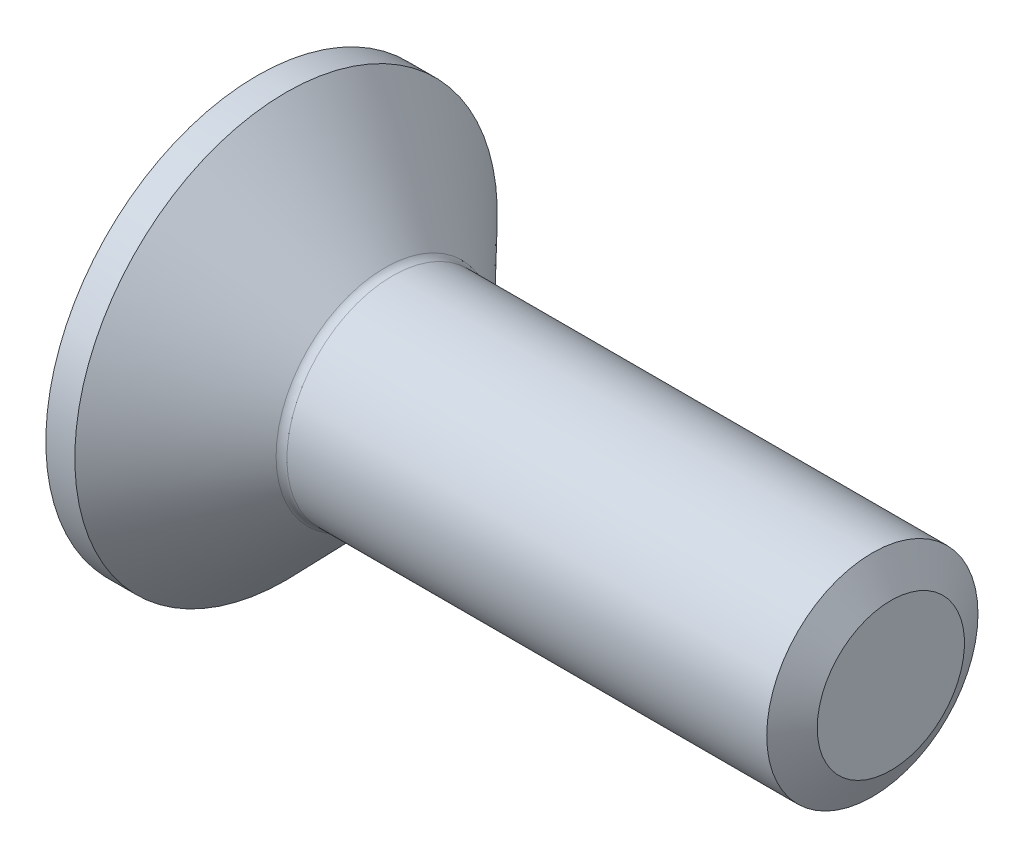
ISO-10303-21;
HEADER;
FILE_DESCRIPTION(('STEP AP214'),'2;1');
FILE_NAME('part.step','',(''),(''),'','','');
FILE_SCHEMA(('AUTOMOTIVE_DESIGN { 1 0 10303 214 1 1 1 1 }'));
ENDSEC;
DATA;
#1=APPLICATION_CONTEXT('core data for automotive mechanical design processes');
#2=APPLICATION_PROTOCOL_DEFINITION('international standard','automotive_design',2000,#1);
#3=PRODUCT_CONTEXT('',#1,'mechanical');
#4=PRODUCT('Part','Part','',(#3));
#5=PRODUCT_RELATED_PRODUCT_CATEGORY('part','',(#4));
#6=PRODUCT_DEFINITION_FORMATION('','',#4);
#7=PRODUCT_DEFINITION_CONTEXT('part definition',#1,'design');
#8=PRODUCT_DEFINITION('design','',#6,#7);
#9=PRODUCT_DEFINITION_SHAPE('','',#8);
#10=(LENGTH_UNIT() NAMED_UNIT(*) SI_UNIT(.MILLI.,.METRE.));
#11=(NAMED_UNIT(*) PLANE_ANGLE_UNIT() SI_UNIT($,.RADIAN.));
#12=(NAMED_UNIT(*) SI_UNIT($,.STERADIAN.) SOLID_ANGLE_UNIT());
#13=UNCERTAINTY_MEASURE_WITH_UNIT(LENGTH_MEASURE(1.E-05),#10,'distance_accuracy_value','');
#14=(GEOMETRIC_REPRESENTATION_CONTEXT(3) GLOBAL_UNCERTAINTY_ASSIGNED_CONTEXT((#13)) GLOBAL_UNIT_ASSIGNED_CONTEXT((#10,
#11,#12)) REPRESENTATION_CONTEXT('',''));
#15=CARTESIAN_POINT('',(0.,0.,0.));
#16=DIRECTION('',(0.,0.,1.));
#17=DIRECTION('',(1.,0.,0.));
#18=AXIS2_PLACEMENT_3D('',#15,#16,#17);
#19=CARTESIAN_POINT('',(0.,0.,0.));
#20=DIRECTION('',(1.,0.,0.));
#21=DIRECTION('',(0.,1.,0.));
#22=AXIS2_PLACEMENT_3D('',#19,#20,#21);
#23=CYLINDRICAL_SURFACE('',#22,2.);
#24=CARTESIAN_POINT('',(-9.43510503675808,0.,0.));
#25=DIRECTION('',(1.,0.,0.));
#26=DIRECTION('',(0.,1.,0.));
#27=AXIS2_PLACEMENT_3D('',#24,#25,#26);
#28=CIRCLE('',#27,2.);
#29=CARTESIAN_POINT('',(-9.43510503675808,2.,0.));
#30=VERTEX_POINT('',#29);
#31=EDGE_CURVE('E125',#30,#30,#28,.T.);
#32=ORIENTED_EDGE('',*,*,#31,.T.);
#33=EDGE_LOOP('',(#32));
#34=FACE_BOUND('',#33,.T.);
#35=CARTESIAN_POINT('',(-0.35,0.,0.));
#36=DIRECTION('',(-1.,0.,0.));
#37=DIRECTION('',(0.,0.,1.));
#38=AXIS2_PLACEMENT_3D('',#35,#36,#37);
#39=CIRCLE('',#38,2.);
#40=CARTESIAN_POINT('',(-0.35,0.,2.));
#41=VERTEX_POINT('',#40);
#42=EDGE_CURVE('E300',#41,#41,#39,.T.);
#43=ORIENTED_EDGE('',*,*,#42,.T.);
#44=EDGE_LOOP('',(#43));
#45=FACE_BOUND('',#44,.T.);
#46=ADVANCED_FACE('F38',(#34,#45),#23,.T.);
#47=CARTESIAN_POINT('',(-12.,4.,0.));
#48=DIRECTION('',(-1.,0.,0.));
#49=DIRECTION('',(0.,-1.,0.));
#50=AXIS2_PLACEMENT_3D('',#47,#48,#49);
#51=PLANE('',#50);
#52=CARTESIAN_POINT('',(-12.,0.,0.));
#53=DIRECTION('',(1.,0.,0.));
#54=DIRECTION('',(0.,1.,0.));
#55=AXIS2_PLACEMENT_3D('',#52,#53,#54);
#56=CIRCLE('',#55,4.);
#57=CARTESIAN_POINT('',(-12.,4.,0.));
#58=VERTEX_POINT('',#57);
#59=EDGE_CURVE('E208',#58,#58,#56,.T.);
#60=ORIENTED_EDGE('',*,*,#59,.F.);
#61=EDGE_LOOP('',(#60));
#62=FACE_BOUND('',#61,.T.);
#63=CARTESIAN_POINT('',(-12.,0.,0.));
#64=DIRECTION('',(-1.,0.,0.));
#65=DIRECTION('',(0.,-1.,0.));
#66=AXIS2_PLACEMENT_3D('',#63,#64,#65);
#67=CIRCLE('',#66,1.44337567297406);
#68=CARTESIAN_POINT('',(-12.,-0.721687836487038,1.24999999999999));
#69=VERTEX_POINT('',#68);
#70=CARTESIAN_POINT('',(-12.,-1.44337567297406,0.));
#71=VERTEX_POINT('',#70);
#72=EDGE_CURVE('E42',#69,#71,#67,.F.);
#73=ORIENTED_EDGE('',*,*,#72,.T.);
#74=CARTESIAN_POINT('',(-12.,-0.721687836487037,-1.24999999999999));
#75=VERTEX_POINT('',#74);
#76=EDGE_CURVE('E11',#71,#75,#67,.F.);
#77=ORIENTED_EDGE('',*,*,#76,.T.);
#78=CARTESIAN_POINT('',(-12.,0.721687836487031,-1.25));
#79=VERTEX_POINT('',#78);
#80=EDGE_CURVE('E47',#75,#79,#67,.F.);
#81=ORIENTED_EDGE('',*,*,#80,.T.);
#82=CARTESIAN_POINT('',(-12.,1.44337567297406,0.));
#83=VERTEX_POINT('',#82);
#84=EDGE_CURVE('E112',#79,#83,#67,.F.);
#85=ORIENTED_EDGE('',*,*,#84,.T.);
#86=CARTESIAN_POINT('',(-12.,0.,0.));
#87=DIRECTION('',(-1.,0.,0.));
#88=DIRECTION('',(0.,0.,1.));
#89=AXIS2_PLACEMENT_3D('',#86,#87,#88);
#90=CIRCLE('',#89,1.44337567297406);
#91=CARTESIAN_POINT('',(-12.,0.721687836487035,1.25));
#92=VERTEX_POINT('',#91);
#93=EDGE_CURVE('E97',#92,#83,#90,.T.);
#94=ORIENTED_EDGE('',*,*,#93,.F.);
#95=EDGE_CURVE('E106',#92,#69,#67,.F.);
#96=ORIENTED_EDGE('',*,*,#95,.T.);
#97=EDGE_LOOP('',(#73,#77,#81,#85,#94,#96));
#98=FACE_BOUND('',#97,.T.);
#99=ADVANCED_FACE('F113',(#62,#98),#51,.T.);
#100=CARTESIAN_POINT('',(0.,0.,0.));
#101=DIRECTION('',(1.,0.,0.));
#102=DIRECTION('',(0.,1.,0.));
#103=AXIS2_PLACEMENT_3D('',#100,#101,#102);
#104=CYLINDRICAL_SURFACE('',#103,4.);
#105=ORIENTED_EDGE('',*,*,#59,.T.);
#106=EDGE_LOOP('',(#105));
#107=FACE_BOUND('',#106,.T.);
#108=CARTESIAN_POINT('',(-11.4513775496141,0.,0.));
#109=DIRECTION('',(1.,0.,0.));
#110=DIRECTION('',(0.,1.,0.));
#111=AXIS2_PLACEMENT_3D('',#108,#109,#110);
#112=CIRCLE('',#111,4.);
#113=CARTESIAN_POINT('',(-11.4513775496141,4.,0.));
#114=VERTEX_POINT('',#113);
#115=EDGE_CURVE('E210',#114,#114,#112,.T.);
#116=ORIENTED_EDGE('',*,*,#115,.F.);
#117=EDGE_LOOP('',(#116));
#118=FACE_BOUND('',#117,.T.);
#119=ADVANCED_FACE('F198',(#107,#118),#104,.T.);
#120=CARTESIAN_POINT('',(-9.57897299682581,0.,0.));
#121=DIRECTION('',(-1.,0.,0.));
#122=DIRECTION('',(0.,-1.,0.));
#123=AXIS2_PLACEMENT_3D('',#120,#121,#122);
#124=CONICAL_SURFACE('',#123,2.0610683259082,0.802851455917394);
#125=ORIENTED_EDGE('',*,*,#115,.T.);
#126=EDGE_LOOP('',(#125));
#127=FACE_BOUND('',#126,.T.);
#128=CARTESIAN_POINT('',(-9.57897299682581,0.,0.));
#129=DIRECTION('',(1.,0.,0.));
#130=DIRECTION('',(0.,1.,0.));
#131=AXIS2_PLACEMENT_3D('',#128,#129,#130);
#132=CIRCLE('',#131,2.0610683259082);
#133=CARTESIAN_POINT('',(-9.57897299682581,2.0610683259082,0.));
#134=VERTEX_POINT('',#133);
#135=EDGE_CURVE('E214',#134,#134,#132,.T.);
#136=ORIENTED_EDGE('',*,*,#135,.F.);
#137=EDGE_LOOP('',(#136));
#138=FACE_BOUND('',#137,.T.);
#139=ADVANCED_FACE('F194',(#127,#138),#124,.T.);
#140=CARTESIAN_POINT('',(-9.43510503675808,0.,0.));
#141=DIRECTION('',(1.,0.,0.));
#142=DIRECTION('',(0.,1.,0.));
#143=AXIS2_PLACEMENT_3D('',#140,#141,#142);
#144=TOROIDAL_SURFACE('',#143,2.2,0.200000000000001);
#145=ORIENTED_EDGE('',*,*,#135,.T.);
#146=EDGE_LOOP('',(#145));
#147=FACE_BOUND('',#146,.T.);
#148=ORIENTED_EDGE('',*,*,#31,.F.);
#149=EDGE_LOOP('',(#148));
#150=FACE_BOUND('',#149,.T.);
#151=ADVANCED_FACE('F190',(#147,#150),#144,.F.);
#152=CARTESIAN_POINT('',(-11.593,0.,0.));
#153=DIRECTION('',(-1.,0.,0.));
#154=DIRECTION('',(0.,0.,1.));
#155=AXIS2_PLACEMENT_3D('',#152,#153,#154);
#156=CONICAL_SURFACE('',#155,0.,1.29595448752628);
#157=CARTESIAN_POINT('',(-12.0000325639069,-0.721572366433196,1.2502));
#158=CARTESIAN_POINT('',(-11.991576864719,-0.751541131585368,1.19829257611634));
#159=CARTESIAN_POINT('',(-11.9838983725877,-0.781569978777701,1.1462810870865));
#160=CARTESIAN_POINT('',(-11.9704054515754,-0.841745134078227,1.04205466075264));
#161=CARTESIAN_POINT('',(-11.964591866691,-0.871891489137523,0.989839642126926));
#162=CARTESIAN_POINT('',(-11.9551735985119,-0.932099362057423,0.885556547214009));
#163=CARTESIAN_POINT('',(-11.9515564854096,-0.962160380653126,0.833489335678977));
#164=CARTESIAN_POINT('',(-11.9467061131036,-1.02232485811963,0.729281403896156));
#165=CARTESIAN_POINT('',(-11.9454723393403,-1.05242830642509,0.677140701948078));
#166=CARTESIAN_POINT('',(-11.9454723393403,-1.11263520303601,0.572859298051921));
#167=CARTESIAN_POINT('',(-11.9467061131036,-1.14273865134147,0.520718596103843));
#168=CARTESIAN_POINT('',(-11.9515564854096,-1.20290312880797,0.416510664321023));
#169=CARTESIAN_POINT('',(-11.9551735985119,-1.23296414740368,0.364443452785991));
#170=CARTESIAN_POINT('',(-11.964591866691,-1.29317202032358,0.260160357873074));
#171=CARTESIAN_POINT('',(-11.9704054515754,-1.32331837538287,0.207945339247363));
#172=CARTESIAN_POINT('',(-11.9838983725877,-1.3834935306834,0.103718912913504));
#173=CARTESIAN_POINT('',(-11.991576864719,-1.41352237787573,0.0517074238836609));
#174=CARTESIAN_POINT('',(-12.0000325639069,-1.4434911430279,-0.000199999999999676));
#175=B_SPLINE_CURVE_WITH_KNOTS('',3,(#157,#158,#159,#160,#161,#162,#163,#164,#165,#166,#167,
#168,#169,#170,#171,#172,#173,#174),.UNSPECIFIED.,.F.,.F.,(4,2,2,2,2,2,2,2,4),(0.,
0.18160374958483,0.36328957156208,0.543937414070992,0.72454625060746,0.905155087143927,
1.08580292965284,1.26748875163009,1.44909250121492),.UNSPECIFIED.);
#176=EDGE_CURVE('E131',#69,#71,#175,.T.);
#177=ORIENTED_EDGE('',*,*,#176,.T.);
#178=ORIENTED_EDGE('',*,*,#72,.F.);
#179=EDGE_LOOP('',(#177,#178));
#180=FACE_BOUND('',#179,.T.);
#181=ADVANCED_FACE('F193',(#180),#156,.F.);
#182=CARTESIAN_POINT('',(-12.230054854727,-1.88192774876372,1.25));
#183=CARTESIAN_POINT('',(-12.2168061816408,-1.8255137400607,1.25));
#184=CARTESIAN_POINT('',(-12.2037258112081,-1.76906017891574,1.25));
#185=CARTESIAN_POINT('',(-12.1779869751788,-1.65605409957583,1.25));
#186=CARTESIAN_POINT('',(-12.1653285307257,-1.59950157657072,1.25));
#187=CARTESIAN_POINT('',(-12.1280879422272,-1.42954612490577,1.25));
#188=CARTESIAN_POINT('',(-12.1042709227473,-1.31597293305457,1.25));
#189=CARTESIAN_POINT('',(-12.0599692539508,-1.08931538105831,1.25));
#190=CARTESIAN_POINT('',(-12.0394543826368,-0.976237048644353,1.25));
#191=CARTESIAN_POINT('',(-12.0031083621366,-0.74933253215309,1.25));
#192=CARTESIAN_POINT('',(-11.9872761488083,-0.635506524005941,1.25));
#193=CARTESIAN_POINT('',(-11.9623551261036,-0.40561706752441,1.25));
#194=CARTESIAN_POINT('',(-11.9533532269162,-0.289543448802647,1.25));
#195=CARTESIAN_POINT('',(-11.9465899221525,-0.115205222838835,1.25));
#196=CARTESIAN_POINT('',(-11.9454583626773,-0.0570644643245781,1.25));
#197=CARTESIAN_POINT('',(-11.9454865772141,0.0592166170352035,1.25));
#198=CARTESIAN_POINT('',(-11.9466463560642,0.117356939879549,1.25));
#199=CARTESIAN_POINT('',(-11.9535104843876,0.29216922677383,1.25));
#200=CARTESIAN_POINT('',(-11.9626193191916,0.408714396179603,1.25));
#201=CARTESIAN_POINT('',(-11.987953181016,0.641062051570891,1.25));
#202=CARTESIAN_POINT('',(-12.0041839479739,0.7568638619043,1.25));
#203=CARTESIAN_POINT('',(-12.0420513932587,0.991534965339216,1.25));
#204=CARTESIAN_POINT('',(-12.063850897622,1.11037712244683,1.25));
#205=CARTESIAN_POINT('',(-12.1107131319875,1.34742332227276,1.25));
#206=CARTESIAN_POINT('',(-12.1357764440616,1.46562724724241,1.25));
#207=CARTESIAN_POINT('',(-12.1880082919745,1.70160185265613,1.25));
#208=CARTESIAN_POINT('',(-12.2151774684754,1.81937238974697,1.25));
#209=CARTESIAN_POINT('',(-12.2709069397528,2.05458449010658,1.25));
#210=CARTESIAN_POINT('',(-12.2994672676032,2.17202604548372,1.25));
#211=CARTESIAN_POINT('',(-12.3571404984079,2.40505512634129,1.25));
#212=CARTESIAN_POINT('',(-12.3862403573857,2.52064589314675,1.25));
#213=CARTESIAN_POINT('',(-12.4451006119577,2.7516618269686,1.25));
#214=CARTESIAN_POINT('',(-12.4748610242592,2.86708698971762,1.25));
#215=CARTESIAN_POINT('',(-12.534817355156,3.09763737586545,1.25));
#216=CARTESIAN_POINT('',(-12.5650125463553,3.21276278881204,1.25));
#217=CARTESIAN_POINT('',(-12.6257689948511,3.44291215791421,1.25));
#218=CARTESIAN_POINT('',(-12.656330237577,3.55793611791374,1.25));
#219=CARTESIAN_POINT('',(-12.687019012393,3.67292565898518,1.25));
#220=B_SPLINE_CURVE_WITH_KNOTS('',3,(#182,#183,#184,#185,#186,#187,#188,#189,#190,#191,#192,
#193,#194,#195,#196,#197,#198,#199,#200,#201,#202,#203,#204,#205,#206,#207,#208,#209,#210,#211,
#212,#213,#214,#215,#216,#217,#218,#219),.UNSPECIFIED.,.F.,.F.,(4,2,2,2,2,2,2,2,2,2,2,2,2,2,2,2,
2,2,4),(0.,0.173845962501762,0.347700623700958,0.695803457931749,1.04051283645618,
1.38514381887278,1.73408963262349,1.90850297063879,2.08291667692807,2.43329501130733,
2.78395625407464,3.14636001893446,3.50882850410612,3.87140769831936,4.2339955168655,
4.59158519290896,4.94918392371833,5.30624137064038,5.66328465178794),.UNSPECIFIED.);
#221=EDGE_CURVE('E102',#92,#69,#220,.F.);
#222=ORIENTED_EDGE('',*,*,#221,.T.);
#223=ORIENTED_EDGE('',*,*,#95,.F.);
#224=EDGE_LOOP('',(#222,#223));
#225=FACE_BOUND('',#224,.T.);
#226=ADVANCED_FACE('F107',(#225),#156,.F.);
#227=CARTESIAN_POINT('',(-12.0000325639069,1.4434911430279,-0.000200000000000113));
#228=CARTESIAN_POINT('',(-11.991576864719,1.41352237787573,0.0517074238836606));
#229=CARTESIAN_POINT('',(-11.9838983725877,1.3834935306834,0.103718912913504));
#230=CARTESIAN_POINT('',(-11.9704054515754,1.32331837538287,0.207945339247363));
#231=CARTESIAN_POINT('',(-11.964591866691,1.29317202032357,0.260160357873074));
#232=CARTESIAN_POINT('',(-11.9551735985119,1.23296414740367,0.364443452785991));
#233=CARTESIAN_POINT('',(-11.9515564854096,1.20290312880797,0.416510664321023));
#234=CARTESIAN_POINT('',(-11.9467061131036,1.14273865134147,0.520718596103843));
#235=CARTESIAN_POINT('',(-11.9454723393403,1.11263520303601,0.572859298051921));
#236=CARTESIAN_POINT('',(-11.9454723393403,1.05242830642509,0.677140701948078));
#237=CARTESIAN_POINT('',(-11.9467061131036,1.02232485811963,0.729281403896156));
#238=CARTESIAN_POINT('',(-11.9515564854096,0.962160380653124,0.833489335678976));
#239=CARTESIAN_POINT('',(-11.9551735985119,0.93209936205742,0.885556547214008));
#240=CARTESIAN_POINT('',(-11.964591866691,0.87189148913752,0.989839642126925));
#241=CARTESIAN_POINT('',(-11.9704054515754,0.841745134078225,1.04205466075264));
#242=CARTESIAN_POINT('',(-11.9838983725877,0.781569978777699,1.1462810870865));
#243=CARTESIAN_POINT('',(-11.991576864719,0.751541131585365,1.19829257611634));
#244=CARTESIAN_POINT('',(-12.0000325639069,0.721572366433194,1.2502));
#245=B_SPLINE_CURVE_WITH_KNOTS('',3,(#227,#228,#229,#230,#231,#232,#233,#234,#235,#236,#237,
#238,#239,#240,#241,#242,#243,#244),.UNSPECIFIED.,.F.,.F.,(4,2,2,2,2,2,2,2,4),(0.,
0.18160374958483,0.363289571562081,0.543937414070992,0.72454625060746,0.905155087143928,
1.08580292965284,1.26748875163009,1.44909250121492),.UNSPECIFIED.);
#246=EDGE_CURVE('E93',#83,#92,#245,.T.);
#247=ORIENTED_EDGE('',*,*,#246,.T.);
#248=ORIENTED_EDGE('',*,*,#93,.T.);
#249=EDGE_LOOP('',(#247,#248));
#250=FACE_BOUND('',#249,.T.);
#251=ADVANCED_FACE('F95',(#250),#156,.F.);
#252=CARTESIAN_POINT('',(-12.0000325639069,0.721572366433193,-1.2502));
#253=CARTESIAN_POINT('',(-11.991576864719,0.751541131585365,-1.19829257611634));
#254=CARTESIAN_POINT('',(-11.9838983725877,0.781569978777698,-1.1462810870865));
#255=CARTESIAN_POINT('',(-11.9704054515754,0.841745134078224,-1.04205466075264));
#256=CARTESIAN_POINT('',(-11.964591866691,0.87189148913752,-0.989839642126926));
#257=CARTESIAN_POINT('',(-11.9551735985119,0.93209936205742,-0.885556547214009));
#258=CARTESIAN_POINT('',(-11.9515564854096,0.962160380653123,-0.833489335678977));
#259=CARTESIAN_POINT('',(-11.9467061131036,1.02232485811963,-0.729281403896157));
#260=CARTESIAN_POINT('',(-11.9454723393403,1.05242830642509,-0.677140701948078));
#261=CARTESIAN_POINT('',(-11.9454723393403,1.11263520303601,-0.572859298051922));
#262=CARTESIAN_POINT('',(-11.9467061131036,1.14273865134147,-0.520718596103843));
#263=CARTESIAN_POINT('',(-11.9515564854096,1.20290312880797,-0.416510664321023));
#264=CARTESIAN_POINT('',(-11.9551735985119,1.23296414740367,-0.364443452785991));
#265=CARTESIAN_POINT('',(-11.964591866691,1.29317202032357,-0.260160357873074));
#266=CARTESIAN_POINT('',(-11.9704054515754,1.32331837538287,-0.207945339247363));
#267=CARTESIAN_POINT('',(-11.9838983725877,1.3834935306834,-0.103718912913504));
#268=CARTESIAN_POINT('',(-11.991576864719,1.41352237787573,-0.0517074238836607));
#269=CARTESIAN_POINT('',(-12.0000325639069,1.4434911430279,0.000200000000000151));
#270=B_SPLINE_CURVE_WITH_KNOTS('',3,(#252,#253,#254,#255,#256,#257,#258,#259,#260,#261,#262,
#263,#264,#265,#266,#267,#268,#269),.UNSPECIFIED.,.F.,.F.,(4,2,2,2,2,2,2,2,4),(0.,
0.18160374958483,0.363289571562081,0.543937414070993,0.724546250607461,0.905155087143928,
1.08580292965284,1.26748875163009,1.44909250121492),.UNSPECIFIED.);
#271=EDGE_CURVE('E115',#79,#83,#270,.T.);
#272=ORIENTED_EDGE('',*,*,#271,.T.);
#273=ORIENTED_EDGE('',*,*,#84,.F.);
#274=EDGE_LOOP('',(#272,#273));
#275=FACE_BOUND('',#274,.T.);
#276=ADVANCED_FACE('F284',(#275),#156,.F.);
#277=CARTESIAN_POINT('',(-12.230054854727,-1.88192774876373,-1.25));
#278=CARTESIAN_POINT('',(-12.2168061816408,-1.82551374006071,-1.25));
#279=CARTESIAN_POINT('',(-12.2037258112081,-1.76906017891574,-1.25));
#280=CARTESIAN_POINT('',(-12.1779869751788,-1.65605409957583,-1.25));
#281=CARTESIAN_POINT('',(-12.1653285307257,-1.59950157657073,-1.25));
#282=CARTESIAN_POINT('',(-12.1280879422272,-1.42954612490578,-1.25));
#283=CARTESIAN_POINT('',(-12.1042709227473,-1.31597293305458,-1.25));
#284=CARTESIAN_POINT('',(-12.0599692539508,-1.08931538105831,-1.25));
#285=CARTESIAN_POINT('',(-12.0394543826368,-0.976237048644354,-1.25));
#286=CARTESIAN_POINT('',(-12.0031083621366,-0.74933253215309,-1.25));
#287=CARTESIAN_POINT('',(-11.9872761488083,-0.63550652400594,-1.25));
#288=CARTESIAN_POINT('',(-11.9623551261036,-0.405617067524409,-1.25));
#289=CARTESIAN_POINT('',(-11.9533532269162,-0.289543448802645,-1.25));
#290=CARTESIAN_POINT('',(-11.9465899221525,-0.115205222838833,-1.25));
#291=CARTESIAN_POINT('',(-11.9454583626773,-0.0570644643245754,-1.25));
#292=CARTESIAN_POINT('',(-11.9454865772141,0.0592166170352066,-1.25));
#293=CARTESIAN_POINT('',(-11.9466463560642,0.117356939879552,-1.25));
#294=CARTESIAN_POINT('',(-11.9535104843876,0.292169226773834,-1.25));
#295=CARTESIAN_POINT('',(-11.9626193191916,0.408714396179608,-1.25));
#296=CARTESIAN_POINT('',(-11.987953181016,0.641062051570897,-1.25));
#297=CARTESIAN_POINT('',(-12.0041839479739,0.756863861904307,-1.25));
#298=CARTESIAN_POINT('',(-12.0420513932587,0.991534965339224,-1.25));
#299=CARTESIAN_POINT('',(-12.063850897622,1.11037712244684,-1.25));
#300=CARTESIAN_POINT('',(-12.1107131319875,1.34742332227277,-1.25));
#301=CARTESIAN_POINT('',(-12.1357764440616,1.46562724724242,-1.25));
#302=CARTESIAN_POINT('',(-12.1880082919745,1.70160185265614,-1.25));
#303=CARTESIAN_POINT('',(-12.2151774684754,1.81937238974698,-1.25));
#304=CARTESIAN_POINT('',(-12.2709069397528,2.05458449010658,-1.25));
#305=CARTESIAN_POINT('',(-12.2994672676032,2.17202604548373,-1.25));
#306=CARTESIAN_POINT('',(-12.3571404984079,2.40505512634129,-1.25));
#307=CARTESIAN_POINT('',(-12.3862403573857,2.52064589314675,-1.25));
#308=CARTESIAN_POINT('',(-12.4451006119577,2.7516618269686,-1.25));
#309=CARTESIAN_POINT('',(-12.4748610242592,2.86708698971762,-1.25));
#310=CARTESIAN_POINT('',(-12.534817355156,3.09763737586545,-1.25));
#311=CARTESIAN_POINT('',(-12.5650125463553,3.21276278881205,-1.25));
#312=CARTESIAN_POINT('',(-12.6257689948511,3.44291215791421,-1.25));
#313=CARTESIAN_POINT('',(-12.656330237577,3.55793611791374,-1.25));
#314=CARTESIAN_POINT('',(-12.687019012393,3.67292565898519,-1.25));
#315=B_SPLINE_CURVE_WITH_KNOTS('',3,(#277,#278,#279,#280,#281,#282,#283,#284,#285,#286,#287,
#288,#289,#290,#291,#292,#293,#294,#295,#296,#297,#298,#299,#300,#301,#302,#303,#304,#305,#306,
#307,#308,#309,#310,#311,#312,#313,#314),.UNSPECIFIED.,.F.,.F.,(4,2,2,2,2,2,2,2,2,2,2,2,2,2,2,2,
2,2,4),(0.,0.173845962501762,0.34770062370096,0.695803457931752,1.04051283645619,
1.38514381887279,1.7340896326235,1.9085029706388,2.08291667692808,2.43329501130734,
2.78395625407465,3.14636001893447,3.50882850410613,3.87140769831937,4.23399551686551,
4.59158519290897,4.94918392371834,5.30624137064039,5.66328465178795),.UNSPECIFIED.);
#316=EDGE_CURVE('E243',#75,#79,#315,.T.);
#317=ORIENTED_EDGE('',*,*,#316,.T.);
#318=ORIENTED_EDGE('',*,*,#80,.F.);
#319=EDGE_LOOP('',(#317,#318));
#320=FACE_BOUND('',#319,.T.);
#321=ADVANCED_FACE('F271',(#320),#156,.F.);
#322=CARTESIAN_POINT('',(-12.0000325639069,-1.4434911430279,0.000199999999999901));
#323=CARTESIAN_POINT('',(-11.991576864719,-1.41352237787573,-0.0517074238836609));
#324=CARTESIAN_POINT('',(-11.9838983725877,-1.3834935306834,-0.103718912913504));
#325=CARTESIAN_POINT('',(-11.9704054515754,-1.32331837538287,-0.207945339247363));
#326=CARTESIAN_POINT('',(-11.964591866691,-1.29317202032358,-0.260160357873074));
#327=CARTESIAN_POINT('',(-11.9551735985119,-1.23296414740368,-0.364443452785991));
#328=CARTESIAN_POINT('',(-11.9515564854096,-1.20290312880797,-0.416510664321023));
#329=CARTESIAN_POINT('',(-11.9467061131036,-1.14273865134147,-0.520718596103843));
#330=CARTESIAN_POINT('',(-11.9454723393403,-1.11263520303601,-0.572859298051922));
#331=CARTESIAN_POINT('',(-11.9454723393403,-1.05242830642509,-0.677140701948078));
#332=CARTESIAN_POINT('',(-11.9467061131036,-1.02232485811963,-0.729281403896156));
#333=CARTESIAN_POINT('',(-11.9515564854096,-0.962160380653126,-0.833489335678977));
#334=CARTESIAN_POINT('',(-11.9551735985119,-0.932099362057422,-0.885556547214009));
#335=CARTESIAN_POINT('',(-11.964591866691,-0.871891489137522,-0.989839642126926));
#336=CARTESIAN_POINT('',(-11.9704054515754,-0.841745134078226,-1.04205466075264));
#337=CARTESIAN_POINT('',(-11.9838983725877,-0.7815699787777,-1.1462810870865));
#338=CARTESIAN_POINT('',(-11.991576864719,-0.751541131585367,-1.19829257611634));
#339=CARTESIAN_POINT('',(-12.0000325639069,-0.721572366433196,-1.2502));
#340=B_SPLINE_CURVE_WITH_KNOTS('',3,(#322,#323,#324,#325,#326,#327,#328,#329,#330,#331,#332,
#333,#334,#335,#336,#337,#338,#339),.UNSPECIFIED.,.F.,.F.,(4,2,2,2,2,2,2,2,4),(0.,
0.18160374958483,0.363289571562081,0.543937414070993,0.72454625060746,0.905155087143928,
1.08580292965284,1.26748875163009,1.44909250121492),.UNSPECIFIED.);
#341=EDGE_CURVE('E133',#71,#75,#340,.T.);
#342=ORIENTED_EDGE('',*,*,#341,.T.);
#343=ORIENTED_EDGE('',*,*,#76,.F.);
#344=EDGE_LOOP('',(#342,#343));
#345=FACE_BOUND('',#344,.T.);
#346=ADVANCED_FACE('F274',(#345),#156,.F.);
#347=CARTESIAN_POINT('',(-10.5,0.,0.));
#348=DIRECTION('',(-1.,0.,0.));
#349=DIRECTION('',(0.,0.,1.));
#350=AXIS2_PLACEMENT_3D('',#347,#348,#349);
#351=CONICAL_SURFACE('',#350,1.44337567297406,1.0471975511966);
#352=CARTESIAN_POINT('',(-9.66666666666667,0.,0.));
#353=VERTEX_POINT('',#352);
#354=VERTEX_LOOP('',#353);
#355=FACE_BOUND('',#354,.T.);
#356=CARTESIAN_POINT('',(-10.9647941109243,-1.86893140179217,1.25));
#357=CARTESIAN_POINT('',(-10.9388968384665,-1.81495202267025,1.25));
#358=CARTESIAN_POINT('',(-10.9132686219312,-1.76084125344196,1.25));
#359=CARTESIAN_POINT('',(-10.8627027606134,-1.65228662652066,1.25));
#360=CARTESIAN_POINT('',(-10.8377652401103,-1.59784271100767,1.25));
#361=CARTESIAN_POINT('',(-10.7885939163498,-1.48823931692675,1.25));
#362=CARTESIAN_POINT('',(-10.7643652994868,-1.43307750108907,1.25));
#363=CARTESIAN_POINT('',(-10.7169950705039,-1.32229188443621,1.25));
#364=CARTESIAN_POINT('',(-10.6938534018645,-1.26666810781962,1.25));
#365=CARTESIAN_POINT('',(-10.6483546130678,-1.15340083047608,1.25));
#366=CARTESIAN_POINT('',(-10.6260338154653,-1.09574254265115,1.25));
#367=CARTESIAN_POINT('',(-10.583255476912,-0.979741082890174,1.25));
#368=CARTESIAN_POINT('',(-10.5627981694397,-0.921397826164637,1.25));
#369=CARTESIAN_POINT('',(-10.5050842376762,-0.745435524772239,1.25));
#370=CARTESIAN_POINT('',(-10.4713502149769,-0.626561938132859,1.25));
#371=CARTESIAN_POINT('',(-10.4322204068282,-0.445873083681238,1.25));
#372=CARTESIAN_POINT('',(-10.4210940606188,-0.385304700192767,1.25));
#373=CARTESIAN_POINT('',(-10.4034278522676,-0.263486592065029,1.25));
#374=CARTESIAN_POINT('',(-10.3968876801832,-0.202236913753246,1.25));
#375=CARTESIAN_POINT('',(-10.3889987810428,-0.0801324468775834,1.25));
#376=CARTESIAN_POINT('',(-10.3875887912582,-0.0192817197887149,1.25));
#377=CARTESIAN_POINT('',(-10.3899161878862,0.102319232701154,1.25));
#378=CARTESIAN_POINT('',(-10.393653893026,0.163069451645862,1.25));
#379=CARTESIAN_POINT('',(-10.4088980280361,0.312961598922926,1.25));
#380=CARTESIAN_POINT('',(-10.4232612484297,0.401813055628261,1.25));
#381=CARTESIAN_POINT('',(-10.4602998495149,0.5777881465832,1.25));
#382=CARTESIAN_POINT('',(-10.4829852483541,0.664909564430751,1.25));
#383=CARTESIAN_POINT('',(-10.5217374532821,0.795209224728794,1.25));
#384=CARTESIAN_POINT('',(-10.5356229448103,0.839061001813536,1.25));
#385=CARTESIAN_POINT('',(-10.5646784153621,0.926308087473956,1.25));
#386=CARTESIAN_POINT('',(-10.5798475927664,0.969703662172462,1.25));
#387=CARTESIAN_POINT('',(-10.6112501339966,1.05609633508794,1.25));
#388=CARTESIAN_POINT('',(-10.627483304423,1.09909350410933,1.25));
#389=CARTESIAN_POINT('',(-10.6608382439108,1.1847490391048,1.25));
#390=CARTESIAN_POINT('',(-10.6779601631043,1.22740734642399,1.25));
#391=CARTESIAN_POINT('',(-10.7227614292321,1.33629459550825,1.25));
#392=CARTESIAN_POINT('',(-10.7509693835735,1.40230581092028,1.25));
#393=CARTESIAN_POINT('',(-10.8087450811585,1.53373213594212,1.25));
#394=CARTESIAN_POINT('',(-10.8383129262699,1.59914720045375,1.25));
#395=CARTESIAN_POINT('',(-10.9285769200244,1.79469680395943,1.25));
#396=CARTESIAN_POINT('',(-10.9908242731852,1.92411390982369,1.25));
#397=CARTESIAN_POINT('',(-11.1179296229027,2.18184246876937,1.25));
#398=CARTESIAN_POINT('',(-11.182790734765,2.31015236703662,1.25));
#399=CARTESIAN_POINT('',(-11.3141807455314,2.56589305685456,1.25));
#400=CARTESIAN_POINT('',(-11.3807094324427,2.69332395754888,1.25));
#401=CARTESIAN_POINT('',(-11.5085820016458,2.93557826301822,1.25));
#402=CARTESIAN_POINT('',(-11.5698225704122,3.05045639113076,1.25));
#403=CARTESIAN_POINT('',(-11.6930014800409,3.27984311898855,1.25));
#404=CARTESIAN_POINT('',(-11.7549398467262,3.39435170485539,1.25));
#405=CARTESIAN_POINT('',(-11.8791811560561,3.62279327872168,1.25));
#406=CARTESIAN_POINT('',(-11.941482770676,3.73672698995314,1.25));
#407=CARTESIAN_POINT('',(-12.0664914919315,3.96436406629495,1.25));
#408=CARTESIAN_POINT('',(-12.1291985771761,4.07806744314788,1.25));
#409=CARTESIAN_POINT('',(-12.1920543493623,4.19168806612954,1.25));
#410=B_SPLINE_CURVE_WITH_KNOTS('',3,(#356,#357,#358,#359,#360,#361,#362,#363,#364,#365,#366,
#367,#368,#369,#370,#371,#372,#373,#374,#375,#376,#377,#378,#379,#380,#381,#382,#383,#384,#385,
#386,#387,#388,#389,#390,#391,#392,#393,#394,#395,#396,#397,#398,#399,#400,#401,#402,#403,#404,
#405,#406,#407,#408,#409),.UNSPECIFIED.,.F.,.F.,(4,2,2,2,2,2,2,2,2,2,2,2,2,2,2,2,2,2,2,2,2,2,2,
2,2,2,4),(0.,0.179612926712517,0.359257964580626,0.53999273561691,0.720718098311216,
0.906167781883881,1.09164066876279,1.4615401462125,1.64614554413148,1.83073846485713,
2.01311967401941,2.19551217609308,2.46497297688035,2.73475922178118,2.8727370232333,
3.01062928909398,3.14849655975687,3.2863871959709,3.50172172546909,3.71707241178641,
4.14784491349866,4.57914698286383,5.0103944976687,5.40093821140479,5.7914964254654,
6.18106124184772,6.57060567131894),.UNSPECIFIED.);
#411=CARTESIAN_POINT('',(-10.5,-0.721687836487034,1.25));
#412=VERTEX_POINT('',#411);
#413=CARTESIAN_POINT('',(-10.5,0.721687836487031,1.25));
#414=VERTEX_POINT('',#413);
#415=EDGE_CURVE('E162',#412,#414,#410,.T.);
#416=ORIENTED_EDGE('',*,*,#415,.T.);
#417=CARTESIAN_POINT('',(-10.500066674666,0.721572366433194,1.2502));
#418=CARTESIAN_POINT('',(-10.4817459147637,0.753288124996229,1.19526669476824));
#419=CARTESIAN_POINT('',(-10.4650833062006,0.785277649221702,1.13985921349976));
#420=CARTESIAN_POINT('',(-10.4359973039458,0.849810733708402,1.02808463239966));
#421=CARTESIAN_POINT('',(-10.4235842019761,0.882355441401181,0.97171554515829));
#422=CARTESIAN_POINT('',(-10.404259687636,0.947041487997316,0.859676025913016));
#423=CARTESIAN_POINT('',(-10.3972196894474,0.979172868975892,0.804022841540771));
#424=CARTESIAN_POINT('',(-10.3888124326306,1.04358696985655,0.692454346091609));
#425=CARTESIAN_POINT('',(-10.3874382152047,1.07586945532687,0.6365394410624));
#426=CARTESIAN_POINT('',(-10.3902833373679,1.13620103554812,0.532042078818275));
#427=CARTESIAN_POINT('',(-10.39380409882,1.16425912049992,0.483444050118685));
#428=CARTESIAN_POINT('',(-10.4049671126993,1.22019247526559,0.386564637826762));
#429=CARTESIAN_POINT('',(-10.4126131855727,1.24806755133608,0.338283589807837));
#430=CARTESIAN_POINT('',(-10.4317294547005,1.30411641158755,0.241204116145957));
#431=CARTESIAN_POINT('',(-10.4432807569797,1.33228309485381,0.192417989648101));
#432=CARTESIAN_POINT('',(-10.4694983146939,1.38819614400745,0.0955737477078981));
#433=CARTESIAN_POINT('',(-10.4841584021391,1.41594322730596,0.0475143896730357));
#434=CARTESIAN_POINT('',(-10.500066674666,1.4434911430279,-0.000200000000000178));
#435=B_SPLINE_CURVE_WITH_KNOTS('',3,(#417,#418,#419,#420,#421,#422,#423,#424,#425,#426,#427,
#428,#429,#430,#431,#432,#433,#434),.UNSPECIFIED.,.F.,.F.,(4,2,2,2,2,2,2,2,4),(0.,
0.198150821029559,0.396778196315221,0.5904886173544,0.783961049317181,0.952480056398646,
1.1211553973001,1.2935743034359,1.4656542697693),.UNSPECIFIED.);
#436=CARTESIAN_POINT('',(-10.5,1.44337567297406,0.));
#437=VERTEX_POINT('',#436);
#438=EDGE_CURVE('E122',#414,#437,#435,.T.);
#439=ORIENTED_EDGE('',*,*,#438,.T.);
#440=CARTESIAN_POINT('',(-10.500066674666,1.4434911430279,0.000199999999999887));
#441=CARTESIAN_POINT('',(-10.4817459147637,1.41177538446487,-0.054733305231765));
#442=CARTESIAN_POINT('',(-10.4650833062006,1.37978586023939,-0.11014078650024));
#443=CARTESIAN_POINT('',(-10.4359973039458,1.31525277575269,-0.22191536760034));
#444=CARTESIAN_POINT('',(-10.4235842019761,1.28270806805991,-0.27828445484171));
#445=CARTESIAN_POINT('',(-10.404259687636,1.21802202146378,-0.390323974086984));
#446=CARTESIAN_POINT('',(-10.3972196894474,1.1858906404852,-0.445977158459229));
#447=CARTESIAN_POINT('',(-10.3888124326306,1.12147653960455,-0.557545653908391));
#448=CARTESIAN_POINT('',(-10.3874382152047,1.08919405413422,-0.6134605589376));
#449=CARTESIAN_POINT('',(-10.3902833373679,1.02886247391297,-0.717957921181725));
#450=CARTESIAN_POINT('',(-10.39380409882,1.00080438896118,-0.766555949881315));
#451=CARTESIAN_POINT('',(-10.4049671126993,0.944871034195503,-0.863435362173238));
#452=CARTESIAN_POINT('',(-10.4126131855727,0.916995958125019,-0.911716410192163));
#453=CARTESIAN_POINT('',(-10.4317294547005,0.860947097873546,-1.00879588385404));
#454=CARTESIAN_POINT('',(-10.4432807569797,0.832780414607289,-1.0575820103519));
#455=CARTESIAN_POINT('',(-10.4694983146939,0.776867365453648,-1.1544262522921));
#456=CARTESIAN_POINT('',(-10.4841584021391,0.74912028215514,-1.20248561032696));
#457=CARTESIAN_POINT('',(-10.500066674666,0.721572366433194,-1.2502));
#458=B_SPLINE_CURVE_WITH_KNOTS('',3,(#440,#441,#442,#443,#444,#445,#446,#447,#448,#449,#450,
#451,#452,#453,#454,#455,#456,#457),.UNSPECIFIED.,.F.,.F.,(4,2,2,2,2,2,2,2,4),(0.,
0.198150821029559,0.396778196315221,0.5904886173544,0.783961049317181,0.952480056398646,
1.1211553973001,1.2935743034359,1.4656542697693),.UNSPECIFIED.);
#459=CARTESIAN_POINT('',(-10.5,0.721687836487033,-1.25));
#460=VERTEX_POINT('',#459);
#461=EDGE_CURVE('E209',#437,#460,#458,.T.);
#462=ORIENTED_EDGE('',*,*,#461,.T.);
#463=CARTESIAN_POINT('',(-10.9647941109243,-1.86893140179217,-1.25));
#464=CARTESIAN_POINT('',(-10.9388968384665,-1.81495202267025,-1.25));
#465=CARTESIAN_POINT('',(-10.9132686219312,-1.76084125344196,-1.25));
#466=CARTESIAN_POINT('',(-10.8627027606134,-1.65228662652066,-1.25));
#467=CARTESIAN_POINT('',(-10.8377652401103,-1.59784271100767,-1.25));
#468=CARTESIAN_POINT('',(-10.7885939163498,-1.48823931692675,-1.25));
#469=CARTESIAN_POINT('',(-10.7643652994868,-1.43307750108907,-1.25));
#470=CARTESIAN_POINT('',(-10.7169950705039,-1.32229188443621,-1.25));
#471=CARTESIAN_POINT('',(-10.6938534018645,-1.26666810781962,-1.25));
#472=CARTESIAN_POINT('',(-10.6483546130678,-1.15340083047608,-1.25));
#473=CARTESIAN_POINT('',(-10.6260338154653,-1.09574254265115,-1.25));
#474=CARTESIAN_POINT('',(-10.583255476912,-0.979741082890174,-1.25));
#475=CARTESIAN_POINT('',(-10.5627981694397,-0.921397826164637,-1.25));
#476=CARTESIAN_POINT('',(-10.5050842376762,-0.745435524772239,-1.25));
#477=CARTESIAN_POINT('',(-10.4713502149769,-0.626561938132859,-1.25));
#478=CARTESIAN_POINT('',(-10.4322204068282,-0.445873083681237,-1.25));
#479=CARTESIAN_POINT('',(-10.4210940606188,-0.385304700192766,-1.25));
#480=CARTESIAN_POINT('',(-10.4034278522676,-0.263486592065028,-1.25));
#481=CARTESIAN_POINT('',(-10.3968876801832,-0.202236913753245,-1.25));
#482=CARTESIAN_POINT('',(-10.3889987810428,-0.0801324468775825,-1.25));
#483=CARTESIAN_POINT('',(-10.3875887912582,-0.0192817197887142,-1.25));
#484=CARTESIAN_POINT('',(-10.3899161878862,0.102319232701154,-1.25));
#485=CARTESIAN_POINT('',(-10.393653893026,0.163069451645862,-1.25));
#486=CARTESIAN_POINT('',(-10.4088980280361,0.312961598922927,-1.25));
#487=CARTESIAN_POINT('',(-10.4232612484297,0.401813055628262,-1.25));
#488=CARTESIAN_POINT('',(-10.4602998495149,0.577788146583201,-1.25));
#489=CARTESIAN_POINT('',(-10.4829852483541,0.664909564430751,-1.25));
#490=CARTESIAN_POINT('',(-10.5217374532821,0.795209224728794,-1.25));
#491=CARTESIAN_POINT('',(-10.5356229448103,0.839061001813537,-1.25));
#492=CARTESIAN_POINT('',(-10.5646784153621,0.926308087473956,-1.25));
#493=CARTESIAN_POINT('',(-10.5798475927664,0.969703662172463,-1.25));
#494=CARTESIAN_POINT('',(-10.6112501339966,1.05609633508794,-1.25));
#495=CARTESIAN_POINT('',(-10.627483304423,1.09909350410934,-1.25));
#496=CARTESIAN_POINT('',(-10.6608382439108,1.1847490391048,-1.25));
#497=CARTESIAN_POINT('',(-10.6779601631043,1.22740734642399,-1.25));
#498=CARTESIAN_POINT('',(-10.7227614292321,1.33629459550825,-1.25));
#499=CARTESIAN_POINT('',(-10.7509693835735,1.40230581092028,-1.25));
#500=CARTESIAN_POINT('',(-10.8087450811585,1.53373213594212,-1.25));
#501=CARTESIAN_POINT('',(-10.8383129262699,1.59914720045375,-1.25));
#502=CARTESIAN_POINT('',(-10.9285769200244,1.79469680395943,-1.25));
#503=CARTESIAN_POINT('',(-10.9908242731852,1.92411390982369,-1.25));
#504=CARTESIAN_POINT('',(-11.1179296229027,2.18184246876937,-1.25));
#505=CARTESIAN_POINT('',(-11.182790734765,2.31015236703662,-1.25));
#506=CARTESIAN_POINT('',(-11.3141807455314,2.56589305685456,-1.25));
#507=CARTESIAN_POINT('',(-11.3807094324427,2.69332395754888,-1.25));
#508=CARTESIAN_POINT('',(-11.5085820016458,2.93557826301822,-1.25));
#509=CARTESIAN_POINT('',(-11.5698225704122,3.05045639113076,-1.25));
#510=CARTESIAN_POINT('',(-11.6930014800409,3.27984311898856,-1.25));
#511=CARTESIAN_POINT('',(-11.7549398467262,3.39435170485539,-1.25));
#512=CARTESIAN_POINT('',(-11.8791811560561,3.62279327872168,-1.25));
#513=CARTESIAN_POINT('',(-11.941482770676,3.73672698995314,-1.25));
#514=CARTESIAN_POINT('',(-12.0664914919315,3.96436406629495,-1.25));
#515=CARTESIAN_POINT('',(-12.1291985771761,4.07806744314788,-1.25));
#516=CARTESIAN_POINT('',(-12.1920543493623,4.19168806612954,-1.25));
#517=B_SPLINE_CURVE_WITH_KNOTS('',3,(#463,#464,#465,#466,#467,#468,#469,#470,#471,#472,#473,
#474,#475,#476,#477,#478,#479,#480,#481,#482,#483,#484,#485,#486,#487,#488,#489,#490,#491,#492,
#493,#494,#495,#496,#497,#498,#499,#500,#501,#502,#503,#504,#505,#506,#507,#508,#509,#510,#511,
#512,#513,#514,#515,#516),.UNSPECIFIED.,.F.,.F.,(4,2,2,2,2,2,2,2,2,2,2,2,2,2,2,2,2,2,2,2,2,2,2,
2,2,2,4),(0.,0.179612926712517,0.359257964580626,0.53999273561691,0.720718098311216,
0.90616778188388,1.09164066876279,1.4615401462125,1.64614554413148,1.83073846485713,
2.01311967401941,2.19551217609308,2.46497297688035,2.73475922178118,2.8727370232333,
3.01062928909398,3.14849655975687,3.2863871959709,3.50172172546909,3.71707241178641,
4.14784491349866,4.57914698286383,5.0103944976687,5.40093821140479,5.7914964254654,
6.18106124184772,6.57060567131894),.UNSPECIFIED.);
#518=CARTESIAN_POINT('',(-10.5,-0.721687836487033,-1.25));
#519=VERTEX_POINT('',#518);
#520=EDGE_CURVE('E101',#460,#519,#517,.F.);
#521=ORIENTED_EDGE('',*,*,#520,.T.);
#522=CARTESIAN_POINT('',(-10.500066674666,-0.721572366433195,-1.2502));
#523=CARTESIAN_POINT('',(-10.4817459147637,-0.753288124996231,-1.19526669476824));
#524=CARTESIAN_POINT('',(-10.4650833062006,-0.785277649221703,-1.13985921349976));
#525=CARTESIAN_POINT('',(-10.4359973039458,-0.849810733708404,-1.02808463239966));
#526=CARTESIAN_POINT('',(-10.4235842019761,-0.882355441401183,-0.97171554515829));
#527=CARTESIAN_POINT('',(-10.404259687636,-0.947041487997318,-0.859676025913016));
#528=CARTESIAN_POINT('',(-10.3972196894474,-0.979172868975894,-0.804022841540771));
#529=CARTESIAN_POINT('',(-10.3888124326306,-1.04358696985655,-0.692454346091609));
#530=CARTESIAN_POINT('',(-10.3874382152047,-1.07586945532687,-0.6365394410624));
#531=CARTESIAN_POINT('',(-10.3902833373679,-1.13620103554813,-0.532042078818275));
#532=CARTESIAN_POINT('',(-10.39380409882,-1.16425912049992,-0.483444050118685));
#533=CARTESIAN_POINT('',(-10.4049671126993,-1.22019247526559,-0.386564637826762));
#534=CARTESIAN_POINT('',(-10.4126131855727,-1.24806755133608,-0.338283589807837));
#535=CARTESIAN_POINT('',(-10.4317294547005,-1.30411641158755,-0.241204116145957));
#536=CARTESIAN_POINT('',(-10.4432807569797,-1.33228309485381,-0.192417989648101));
#537=CARTESIAN_POINT('',(-10.4694983146939,-1.38819614400745,-0.0955737477078982));
#538=CARTESIAN_POINT('',(-10.4841584021391,-1.41594322730596,-0.0475143896730361));
#539=CARTESIAN_POINT('',(-10.500066674666,-1.4434911430279,0.000199999999999536));
#540=B_SPLINE_CURVE_WITH_KNOTS('',3,(#522,#523,#524,#525,#526,#527,#528,#529,#530,#531,#532,
#533,#534,#535,#536,#537,#538,#539),.UNSPECIFIED.,.F.,.F.,(4,2,2,2,2,2,2,2,4),(0.,
0.198150821029559,0.396778196315221,0.590488617354399,0.783961049317181,0.952480056398646,
1.1211553973001,1.2935743034359,1.4656542697693),.UNSPECIFIED.);
#541=CARTESIAN_POINT('',(-10.5,-1.44337567297407,0.));
#542=VERTEX_POINT('',#541);
#543=EDGE_CURVE('E258',#519,#542,#540,.T.);
#544=ORIENTED_EDGE('',*,*,#543,.T.);
#545=CARTESIAN_POINT('',(-10.500066674666,-1.4434911430279,-0.000200000000000103));
#546=CARTESIAN_POINT('',(-10.4817459147637,-1.41177538446487,0.054733305231765));
#547=CARTESIAN_POINT('',(-10.4650833062006,-1.3797858602394,0.11014078650024));
#548=CARTESIAN_POINT('',(-10.4359973039458,-1.31525277575269,0.22191536760034));
#549=CARTESIAN_POINT('',(-10.4235842019761,-1.28270806805992,0.27828445484171));
#550=CARTESIAN_POINT('',(-10.404259687636,-1.21802202146378,0.390323974086985));
#551=CARTESIAN_POINT('',(-10.3972196894474,-1.1858906404852,0.44597715845923));
#552=CARTESIAN_POINT('',(-10.3888124326306,-1.12147653960455,0.557545653908391));
#553=CARTESIAN_POINT('',(-10.3874382152047,-1.08919405413422,0.6134605589376));
#554=CARTESIAN_POINT('',(-10.3902833373679,-1.02886247391297,0.717957921181725));
#555=CARTESIAN_POINT('',(-10.39380409882,-1.00080438896118,0.766555949881315));
#556=CARTESIAN_POINT('',(-10.4049671126993,-0.944871034195505,0.863435362173238));
#557=CARTESIAN_POINT('',(-10.4126131855727,-0.916995958125021,0.911716410192163));
#558=CARTESIAN_POINT('',(-10.4317294547005,-0.860947097873548,1.00879588385404));
#559=CARTESIAN_POINT('',(-10.4432807569797,-0.832780414607291,1.0575820103519));
#560=CARTESIAN_POINT('',(-10.4694983146939,-0.77686736545365,1.1544262522921));
#561=CARTESIAN_POINT('',(-10.4841584021391,-0.749120282155142,1.20248561032696));
#562=CARTESIAN_POINT('',(-10.500066674666,-0.721572366433196,1.2502));
#563=B_SPLINE_CURVE_WITH_KNOTS('',3,(#545,#546,#547,#548,#549,#550,#551,#552,#553,#554,#555,
#556,#557,#558,#559,#560,#561,#562),.UNSPECIFIED.,.F.,.F.,(4,2,2,2,2,2,2,2,4),(0.,
0.19815082102956,0.396778196315221,0.5904886173544,0.783961049317181,0.952480056398646,
1.1211553973001,1.2935743034359,1.4656542697693),.UNSPECIFIED.);
#564=EDGE_CURVE('E168',#542,#412,#563,.T.);
#565=ORIENTED_EDGE('',*,*,#564,.T.);
#566=EDGE_LOOP('',(#416,#439,#462,#521,#544,#565));
#567=FACE_BOUND('',#566,.T.);
#568=ADVANCED_FACE('F156',(#355,#567),#351,.F.);
#569=CARTESIAN_POINT('',(-9.42,1.44337567297406,0.));
#570=DIRECTION('',(0.,0.866025403784439,-0.5));
#571=DIRECTION('',(0.,0.5,0.866025403784439));
#572=AXIS2_PLACEMENT_3D('',#569,#570,#571);
#573=PLANE('',#572);
#574=ORIENTED_EDGE('',*,*,#271,.F.);
#575=DIRECTION('',(-1.,0.,0.));
#576=VECTOR('',#575,1.);
#577=CARTESIAN_POINT('',(-9.42,0.721687836487032,-1.25));
#578=LINE('',#577,#576);
#579=EDGE_CURVE('E226',#460,#79,#578,.T.);
#580=ORIENTED_EDGE('',*,*,#579,.F.);
#581=ORIENTED_EDGE('',*,*,#461,.F.);
#582=DIRECTION('',(-1.,0.,0.));
#583=VECTOR('',#582,1.);
#584=CARTESIAN_POINT('',(-9.42,1.44337567297406,0.));
#585=LINE('',#584,#583);
#586=EDGE_CURVE('E176',#437,#83,#585,.T.);
#587=ORIENTED_EDGE('',*,*,#586,.T.);
#588=EDGE_LOOP('',(#574,#580,#581,#587));
#589=FACE_BOUND('',#588,.T.);
#590=ADVANCED_FACE('F183',(#589),#573,.F.);
#591=CARTESIAN_POINT('',(-9.42,0.721687836487032,-1.25));
#592=DIRECTION('',(0.,0.,-1.));
#593=DIRECTION('',(-1.,0.,0.));
#594=AXIS2_PLACEMENT_3D('',#591,#592,#593);
#595=PLANE('',#594);
#596=ORIENTED_EDGE('',*,*,#316,.F.);
#597=DIRECTION('',(-1.,0.,0.));
#598=VECTOR('',#597,1.);
#599=CARTESIAN_POINT('',(-9.42,-0.721687836487033,-1.25));
#600=LINE('',#599,#598);
#601=EDGE_CURVE('E229',#519,#75,#600,.T.);
#602=ORIENTED_EDGE('',*,*,#601,.F.);
#603=ORIENTED_EDGE('',*,*,#520,.F.);
#604=ORIENTED_EDGE('',*,*,#579,.T.);
#605=EDGE_LOOP('',(#596,#602,#603,#604));
#606=FACE_BOUND('',#605,.T.);
#607=ADVANCED_FACE('F255',(#606),#595,.F.);
#608=CARTESIAN_POINT('',(-9.42,-0.721687836487033,-1.25));
#609=DIRECTION('',(0.,-0.866025403784439,-0.5));
#610=DIRECTION('',(0.,0.5,-0.866025403784439));
#611=AXIS2_PLACEMENT_3D('',#608,#609,#610);
#612=PLANE('',#611);
#613=ORIENTED_EDGE('',*,*,#341,.F.);
#614=DIRECTION('',(-1.,0.,0.));
#615=VECTOR('',#614,1.);
#616=CARTESIAN_POINT('',(-9.42,-1.44337567297407,0.));
#617=LINE('',#616,#615);
#618=EDGE_CURVE('E232',#542,#71,#617,.T.);
#619=ORIENTED_EDGE('',*,*,#618,.F.);
#620=ORIENTED_EDGE('',*,*,#543,.F.);
#621=ORIENTED_EDGE('',*,*,#601,.T.);
#622=EDGE_LOOP('',(#613,#619,#620,#621));
#623=FACE_BOUND('',#622,.T.);
#624=ADVANCED_FACE('F240',(#623),#612,.F.);
#625=CARTESIAN_POINT('',(-9.42,-1.44337567297407,0.));
#626=DIRECTION('',(0.,-0.866025403784439,0.5));
#627=DIRECTION('',(0.,-0.5,-0.866025403784439));
#628=AXIS2_PLACEMENT_3D('',#625,#626,#627);
#629=PLANE('',#628);
#630=ORIENTED_EDGE('',*,*,#176,.F.);
#631=DIRECTION('',(-1.,0.,0.));
#632=VECTOR('',#631,1.);
#633=CARTESIAN_POINT('',(-9.42,-0.721687836487034,1.25));
#634=LINE('',#633,#632);
#635=EDGE_CURVE('E126',#412,#69,#634,.T.);
#636=ORIENTED_EDGE('',*,*,#635,.F.);
#637=ORIENTED_EDGE('',*,*,#564,.F.);
#638=ORIENTED_EDGE('',*,*,#618,.T.);
#639=EDGE_LOOP('',(#630,#636,#637,#638));
#640=FACE_BOUND('',#639,.T.);
#641=ADVANCED_FACE('F155',(#640),#629,.F.);
#642=CARTESIAN_POINT('',(-9.42,-0.721687836487034,1.25));
#643=DIRECTION('',(0.,0.,1.));
#644=DIRECTION('',(0.,-1.,0.));
#645=AXIS2_PLACEMENT_3D('',#642,#643,#644);
#646=PLANE('',#645);
#647=ORIENTED_EDGE('',*,*,#221,.F.);
#648=DIRECTION('',(-1.,0.,0.));
#649=VECTOR('',#648,1.);
#650=CARTESIAN_POINT('',(-9.42,0.721687836487032,1.25));
#651=LINE('',#650,#649);
#652=EDGE_CURVE('E119',#414,#92,#651,.T.);
#653=ORIENTED_EDGE('',*,*,#652,.F.);
#654=ORIENTED_EDGE('',*,*,#415,.F.);
#655=ORIENTED_EDGE('',*,*,#635,.T.);
#656=EDGE_LOOP('',(#647,#653,#654,#655));
#657=FACE_BOUND('',#656,.T.);
#658=ADVANCED_FACE('F128',(#657),#646,.F.);
#659=CARTESIAN_POINT('',(-9.42,0.721687836487032,1.25));
#660=DIRECTION('',(0.,0.866025403784439,0.5));
#661=DIRECTION('',(0.,-0.5,0.866025403784439));
#662=AXIS2_PLACEMENT_3D('',#659,#660,#661);
#663=PLANE('',#662);
#664=ORIENTED_EDGE('',*,*,#246,.F.);
#665=ORIENTED_EDGE('',*,*,#586,.F.);
#666=ORIENTED_EDGE('',*,*,#438,.F.);
#667=ORIENTED_EDGE('',*,*,#652,.T.);
#668=EDGE_LOOP('',(#664,#665,#666,#667));
#669=FACE_BOUND('',#668,.T.);
#670=ADVANCED_FACE('F120',(#669),#663,.F.);
#671=CARTESIAN_POINT('',(-0.35,0.,0.));
#672=DIRECTION('',(-1.,0.,0.));
#673=DIRECTION('',(0.,0.,1.));
#674=AXIS2_PLACEMENT_3D('',#671,#672,#673);
#675=CONICAL_SURFACE('',#674,2.,1.0471975511966);
#676=CARTESIAN_POINT('',(0.,0.,0.));
#677=DIRECTION('',(-1.,0.,0.));
#678=DIRECTION('',(0.,0.,1.));
#679=AXIS2_PLACEMENT_3D('',#676,#677,#678);
#680=CIRCLE('',#679,1.39378221735089);
#681=CARTESIAN_POINT('',(0.,0.,1.39378221735089));
#682=VERTEX_POINT('',#681);
#683=EDGE_CURVE('E116',#682,#682,#680,.T.);
#684=ORIENTED_EDGE('',*,*,#683,.T.);
#685=EDGE_LOOP('',(#684));
#686=FACE_BOUND('',#685,.T.);
#687=ORIENTED_EDGE('',*,*,#42,.F.);
#688=EDGE_LOOP('',(#687));
#689=FACE_BOUND('',#688,.T.);
#690=ADVANCED_FACE('F182',(#686,#689),#675,.T.);
#691=CARTESIAN_POINT('',(0.,0.,0.));
#692=DIRECTION('',(1.,0.,0.));
#693=DIRECTION('',(0.,1.,0.));
#694=AXIS2_PLACEMENT_3D('',#691,#692,#693);
#695=PLANE('',#694);
#696=ORIENTED_EDGE('',*,*,#683,.F.);
#697=EDGE_LOOP('',(#696));
#698=FACE_BOUND('',#697,.T.);
#699=ADVANCED_FACE('F40',(#698),#695,.T.);
#700=CLOSED_SHELL('',(#46,#99,#119,#139,#151,#181,#226,#251,#276,#321,#346,#568,#590,#607,#624,
#641,#658,#670,#690,#699));
#701=MANIFOLD_SOLID_BREP('B2',#700);
#702=ADVANCED_BREP_SHAPE_REPRESENTATION('',(#18,#701),#14);
#703=SHAPE_DEFINITION_REPRESENTATION(#9,#702);
ENDSEC;
END-ISO-10303-21;
